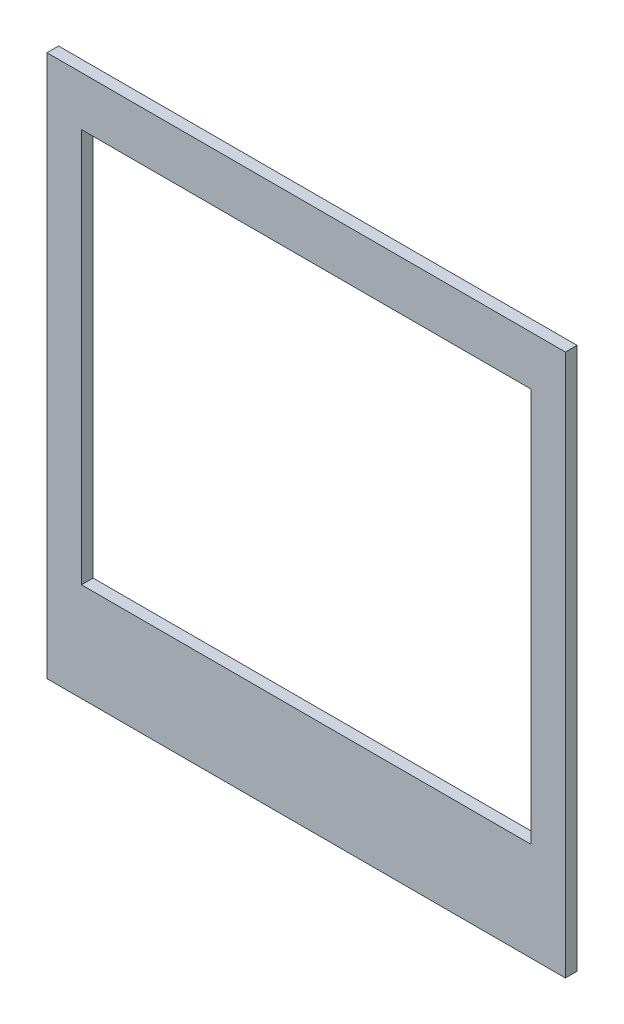
ISO-10303-21;
HEADER;
FILE_DESCRIPTION(('STEP AP214'),'2;1');
FILE_NAME('part.step','',(''),(''),'','','');
FILE_SCHEMA(('AUTOMOTIVE_DESIGN { 1 0 10303 214 1 1 1 1 }'));
ENDSEC;
DATA;
#1=APPLICATION_CONTEXT('core data for automotive mechanical design processes');
#2=APPLICATION_PROTOCOL_DEFINITION('international standard','automotive_design',2000,#1);
#3=PRODUCT_CONTEXT('',#1,'mechanical');
#4=PRODUCT('Part','Part','',(#3));
#5=PRODUCT_RELATED_PRODUCT_CATEGORY('part','',(#4));
#6=PRODUCT_DEFINITION_FORMATION('','',#4);
#7=PRODUCT_DEFINITION_CONTEXT('part definition',#1,'design');
#8=PRODUCT_DEFINITION('design','',#6,#7);
#9=PRODUCT_DEFINITION_SHAPE('','',#8);
#10=(LENGTH_UNIT() NAMED_UNIT(*) SI_UNIT(.MILLI.,.METRE.));
#11=(NAMED_UNIT(*) PLANE_ANGLE_UNIT() SI_UNIT($,.RADIAN.));
#12=(NAMED_UNIT(*) SI_UNIT($,.STERADIAN.) SOLID_ANGLE_UNIT());
#13=UNCERTAINTY_MEASURE_WITH_UNIT(LENGTH_MEASURE(1.E-05),#10,'distance_accuracy_value','');
#14=(GEOMETRIC_REPRESENTATION_CONTEXT(3) GLOBAL_UNCERTAINTY_ASSIGNED_CONTEXT((#13)) GLOBAL_UNIT_ASSIGNED_CONTEXT((#10,
#11,#12)) REPRESENTATION_CONTEXT('',''));
#15=CARTESIAN_POINT('',(0.,0.,0.));
#16=DIRECTION('',(0.,0.,1.));
#17=DIRECTION('',(1.,0.,0.));
#18=AXIS2_PLACEMENT_3D('',#15,#16,#17);
#19=CARTESIAN_POINT('',(0.,0.,3.));
#20=DIRECTION('',(0.,0.,-1.));
#21=DIRECTION('',(-1.,0.,0.));
#22=AXIS2_PLACEMENT_3D('',#19,#20,#21);
#23=PLANE('',#22);
#24=DIRECTION('',(0.,-1.,0.));
#25=VECTOR('',#24,1.);
#26=CARTESIAN_POINT('',(784.214713692254,851.828278213205,3.));
#27=LINE('',#26,#25);
#28=CARTESIAN_POINT('',(784.214713692254,991.528278213205,3.));
#29=VERTEX_POINT('',#28);
#30=CARTESIAN_POINT('',(784.214713692254,851.828278213205,3.));
#31=VERTEX_POINT('',#30);
#32=EDGE_CURVE('E142',#29,#31,#27,.T.);
#33=ORIENTED_EDGE('',*,*,#32,.T.);
#34=DIRECTION('',(1.,0.,0.));
#35=VECTOR('',#34,1.);
#36=CARTESIAN_POINT('',(917.818713692254,851.828278213205,3.));
#37=LINE('',#36,#35);
#38=CARTESIAN_POINT('',(917.818713692254,851.828278213205,3.));
#39=VERTEX_POINT('',#38);
#40=EDGE_CURVE('E145',#31,#39,#37,.T.);
#41=ORIENTED_EDGE('',*,*,#40,.T.);
#42=DIRECTION('',(0.,1.,0.));
#43=VECTOR('',#42,1.);
#44=CARTESIAN_POINT('',(917.818713692254,991.528278213205,3.));
#45=LINE('',#44,#43);
#46=CARTESIAN_POINT('',(917.818713692254,991.528278213205,3.));
#47=VERTEX_POINT('',#46);
#48=EDGE_CURVE('E148',#39,#47,#45,.T.);
#49=ORIENTED_EDGE('',*,*,#48,.T.);
#50=DIRECTION('',(-1.,0.,0.));
#51=VECTOR('',#50,1.);
#52=CARTESIAN_POINT('',(784.214713692254,991.528278213205,3.));
#53=LINE('',#52,#51);
#54=EDGE_CURVE('E150',#47,#29,#53,.T.);
#55=ORIENTED_EDGE('',*,*,#54,.T.);
#56=EDGE_LOOP('',(#33,#41,#49,#55));
#57=FACE_BOUND('',#56,.T.);
#58=DIRECTION('',(1.,0.,0.));
#59=VECTOR('',#58,1.);
#60=CARTESIAN_POINT('',(908.928713692255,877.228278213205,3.));
#61=LINE('',#60,#59);
#62=CARTESIAN_POINT('',(793.104713692254,877.228278213205,3.));
#63=VERTEX_POINT('',#62);
#64=CARTESIAN_POINT('',(908.928713692255,877.228278213205,3.));
#65=VERTEX_POINT('',#64);
#66=EDGE_CURVE('E106',#63,#65,#61,.T.);
#67=ORIENTED_EDGE('',*,*,#66,.F.);
#68=DIRECTION('',(0.,-1.,0.));
#69=VECTOR('',#68,1.);
#70=CARTESIAN_POINT('',(793.104713692254,877.228278213205,3.));
#71=LINE('',#70,#69);
#72=CARTESIAN_POINT('',(793.104713692254,978.828278213205,3.));
#73=VERTEX_POINT('',#72);
#74=EDGE_CURVE('E128',#73,#63,#71,.T.);
#75=ORIENTED_EDGE('',*,*,#74,.F.);
#76=DIRECTION('',(-1.,0.,0.));
#77=VECTOR('',#76,1.);
#78=CARTESIAN_POINT('',(793.104713692254,978.828278213205,3.));
#79=LINE('',#78,#77);
#80=CARTESIAN_POINT('',(908.928713692255,978.828278213205,3.));
#81=VERTEX_POINT('',#80);
#82=EDGE_CURVE('E126',#81,#73,#79,.T.);
#83=ORIENTED_EDGE('',*,*,#82,.F.);
#84=DIRECTION('',(0.,1.,0.));
#85=VECTOR('',#84,1.);
#86=CARTESIAN_POINT('',(908.928713692255,978.828278213205,3.));
#87=LINE('',#86,#85);
#88=EDGE_CURVE('E114',#65,#81,#87,.T.);
#89=ORIENTED_EDGE('',*,*,#88,.F.);
#90=EDGE_LOOP('',(#67,#75,#83,#89));
#91=FACE_BOUND('',#90,.T.);
#92=ADVANCED_FACE('F41',(#57,#91),#23,.F.);
#93=CARTESIAN_POINT('',(0.,0.,0.));
#94=DIRECTION('',(0.,0.,-1.));
#95=DIRECTION('',(-1.,0.,0.));
#96=AXIS2_PLACEMENT_3D('',#93,#94,#95);
#97=PLANE('',#96);
#98=DIRECTION('',(0.,-1.,0.));
#99=VECTOR('',#98,1.);
#100=CARTESIAN_POINT('',(784.214713692254,851.828278213205,0.));
#101=LINE('',#100,#99);
#102=CARTESIAN_POINT('',(784.214713692254,991.528278213205,0.));
#103=VERTEX_POINT('',#102);
#104=CARTESIAN_POINT('',(784.214713692254,851.828278213205,0.));
#105=VERTEX_POINT('',#104);
#106=EDGE_CURVE('E122',#103,#105,#101,.T.);
#107=ORIENTED_EDGE('',*,*,#106,.F.);
#108=DIRECTION('',(-1.,0.,0.));
#109=VECTOR('',#108,1.);
#110=CARTESIAN_POINT('',(784.214713692254,991.528278213205,0.));
#111=LINE('',#110,#109);
#112=CARTESIAN_POINT('',(917.818713692254,991.528278213205,0.));
#113=VERTEX_POINT('',#112);
#114=EDGE_CURVE('E146',#113,#103,#111,.T.);
#115=ORIENTED_EDGE('',*,*,#114,.F.);
#116=DIRECTION('',(0.,1.,0.));
#117=VECTOR('',#116,1.);
#118=CARTESIAN_POINT('',(917.818713692254,991.528278213205,0.));
#119=LINE('',#118,#117);
#120=CARTESIAN_POINT('',(917.818713692254,851.828278213205,0.));
#121=VERTEX_POINT('',#120);
#122=EDGE_CURVE('E157',#121,#113,#119,.T.);
#123=ORIENTED_EDGE('',*,*,#122,.F.);
#124=DIRECTION('',(1.,0.,0.));
#125=VECTOR('',#124,1.);
#126=CARTESIAN_POINT('',(917.818713692254,851.828278213205,0.));
#127=LINE('',#126,#125);
#128=EDGE_CURVE('E155',#105,#121,#127,.T.);
#129=ORIENTED_EDGE('',*,*,#128,.F.);
#130=EDGE_LOOP('',(#107,#115,#123,#129));
#131=FACE_BOUND('',#130,.T.);
#132=DIRECTION('',(0.,-1.,0.));
#133=VECTOR('',#132,1.);
#134=CARTESIAN_POINT('',(793.104713692254,877.228278213205,0.));
#135=LINE('',#134,#133);
#136=CARTESIAN_POINT('',(793.104713692254,978.828278213205,0.));
#137=VERTEX_POINT('',#136);
#138=CARTESIAN_POINT('',(793.104713692254,877.228278213205,0.));
#139=VERTEX_POINT('',#138);
#140=EDGE_CURVE('E115',#137,#139,#135,.T.);
#141=ORIENTED_EDGE('',*,*,#140,.T.);
#142=DIRECTION('',(1.,0.,0.));
#143=VECTOR('',#142,1.);
#144=CARTESIAN_POINT('',(908.928713692255,877.228278213205,0.));
#145=LINE('',#144,#143);
#146=CARTESIAN_POINT('',(908.928713692255,877.228278213205,0.));
#147=VERTEX_POINT('',#146);
#148=EDGE_CURVE('E64',#139,#147,#145,.T.);
#149=ORIENTED_EDGE('',*,*,#148,.T.);
#150=DIRECTION('',(0.,1.,0.));
#151=VECTOR('',#150,1.);
#152=CARTESIAN_POINT('',(908.928713692255,978.828278213205,0.));
#153=LINE('',#152,#151);
#154=CARTESIAN_POINT('',(908.928713692255,978.828278213205,0.));
#155=VERTEX_POINT('',#154);
#156=EDGE_CURVE('E121',#147,#155,#153,.T.);
#157=ORIENTED_EDGE('',*,*,#156,.T.);
#158=DIRECTION('',(-1.,0.,0.));
#159=VECTOR('',#158,1.);
#160=CARTESIAN_POINT('',(793.104713692254,978.828278213205,0.));
#161=LINE('',#160,#159);
#162=EDGE_CURVE('E134',#155,#137,#161,.T.);
#163=ORIENTED_EDGE('',*,*,#162,.T.);
#164=EDGE_LOOP('',(#141,#149,#157,#163));
#165=FACE_BOUND('',#164,.T.);
#166=ADVANCED_FACE('F175',(#131,#165),#97,.T.);
#167=CARTESIAN_POINT('',(784.214713692254,851.828278213205,3.));
#168=DIRECTION('',(1.,0.,0.));
#169=DIRECTION('',(0.,0.,-1.));
#170=AXIS2_PLACEMENT_3D('',#167,#168,#169);
#171=PLANE('',#170);
#172=ORIENTED_EDGE('',*,*,#106,.T.);
#173=DIRECTION('',(0.,0.,-1.));
#174=VECTOR('',#173,1.);
#175=CARTESIAN_POINT('',(784.214713692254,851.828278213205,3.));
#176=LINE('',#175,#174);
#177=EDGE_CURVE('E11',#31,#105,#176,.T.);
#178=ORIENTED_EDGE('',*,*,#177,.F.);
#179=ORIENTED_EDGE('',*,*,#32,.F.);
#180=DIRECTION('',(0.,0.,-1.));
#181=VECTOR('',#180,1.);
#182=CARTESIAN_POINT('',(784.214713692254,991.528278213205,3.));
#183=LINE('',#182,#181);
#184=EDGE_CURVE('E152',#29,#103,#183,.T.);
#185=ORIENTED_EDGE('',*,*,#184,.T.);
#186=EDGE_LOOP('',(#172,#178,#179,#185));
#187=FACE_BOUND('',#186,.T.);
#188=ADVANCED_FACE('F43',(#187),#171,.F.);
#189=CARTESIAN_POINT('',(917.818713692254,851.828278213205,3.));
#190=DIRECTION('',(0.,1.,0.));
#191=DIRECTION('',(0.,0.,1.));
#192=AXIS2_PLACEMENT_3D('',#189,#190,#191);
#193=PLANE('',#192);
#194=ORIENTED_EDGE('',*,*,#128,.T.);
#195=DIRECTION('',(0.,0.,-1.));
#196=VECTOR('',#195,1.);
#197=CARTESIAN_POINT('',(917.818713692254,851.828278213205,3.));
#198=LINE('',#197,#196);
#199=EDGE_CURVE('E49',#39,#121,#198,.T.);
#200=ORIENTED_EDGE('',*,*,#199,.F.);
#201=ORIENTED_EDGE('',*,*,#40,.F.);
#202=ORIENTED_EDGE('',*,*,#177,.T.);
#203=EDGE_LOOP('',(#194,#200,#201,#202));
#204=FACE_BOUND('',#203,.T.);
#205=ADVANCED_FACE('F185',(#204),#193,.F.);
#206=CARTESIAN_POINT('',(917.818713692254,991.528278213205,3.));
#207=DIRECTION('',(-1.,0.,0.));
#208=DIRECTION('',(0.,0.,1.));
#209=AXIS2_PLACEMENT_3D('',#206,#207,#208);
#210=PLANE('',#209);
#211=ORIENTED_EDGE('',*,*,#122,.T.);
#212=DIRECTION('',(0.,0.,-1.));
#213=VECTOR('',#212,1.);
#214=CARTESIAN_POINT('',(917.818713692254,991.528278213205,3.));
#215=LINE('',#214,#213);
#216=EDGE_CURVE('E162',#47,#113,#215,.T.);
#217=ORIENTED_EDGE('',*,*,#216,.F.);
#218=ORIENTED_EDGE('',*,*,#48,.F.);
#219=ORIENTED_EDGE('',*,*,#199,.T.);
#220=EDGE_LOOP('',(#211,#217,#218,#219));
#221=FACE_BOUND('',#220,.T.);
#222=ADVANCED_FACE('F169',(#221),#210,.F.);
#223=CARTESIAN_POINT('',(784.214713692254,991.528278213205,3.));
#224=DIRECTION('',(0.,-1.,0.));
#225=DIRECTION('',(0.,0.,-1.));
#226=AXIS2_PLACEMENT_3D('',#223,#224,#225);
#227=PLANE('',#226);
#228=ORIENTED_EDGE('',*,*,#114,.T.);
#229=ORIENTED_EDGE('',*,*,#184,.F.);
#230=ORIENTED_EDGE('',*,*,#54,.F.);
#231=ORIENTED_EDGE('',*,*,#216,.T.);
#232=EDGE_LOOP('',(#228,#229,#230,#231));
#233=FACE_BOUND('',#232,.T.);
#234=ADVANCED_FACE('F179',(#233),#227,.F.);
#235=CARTESIAN_POINT('',(908.928713692255,877.228278213205,3.));
#236=DIRECTION('',(0.,1.,0.));
#237=DIRECTION('',(0.,0.,1.));
#238=AXIS2_PLACEMENT_3D('',#235,#236,#237);
#239=PLANE('',#238);
#240=ORIENTED_EDGE('',*,*,#148,.F.);
#241=DIRECTION('',(0.,0.,-1.));
#242=VECTOR('',#241,1.);
#243=CARTESIAN_POINT('',(793.104713692254,877.228278213205,3.));
#244=LINE('',#243,#242);
#245=EDGE_CURVE('E110',#63,#139,#244,.T.);
#246=ORIENTED_EDGE('',*,*,#245,.F.);
#247=ORIENTED_EDGE('',*,*,#66,.T.);
#248=DIRECTION('',(0.,0.,-1.));
#249=VECTOR('',#248,1.);
#250=CARTESIAN_POINT('',(908.928713692255,877.228278213205,3.));
#251=LINE('',#250,#249);
#252=EDGE_CURVE('E109',#65,#147,#251,.T.);
#253=ORIENTED_EDGE('',*,*,#252,.T.);
#254=EDGE_LOOP('',(#240,#246,#247,#253));
#255=FACE_BOUND('',#254,.T.);
#256=ADVANCED_FACE('F108',(#255),#239,.T.);
#257=CARTESIAN_POINT('',(908.928713692255,978.828278213205,3.));
#258=DIRECTION('',(-1.,0.,0.));
#259=DIRECTION('',(0.,0.,1.));
#260=AXIS2_PLACEMENT_3D('',#257,#258,#259);
#261=PLANE('',#260);
#262=ORIENTED_EDGE('',*,*,#156,.F.);
#263=ORIENTED_EDGE('',*,*,#252,.F.);
#264=ORIENTED_EDGE('',*,*,#88,.T.);
#265=DIRECTION('',(0.,0.,-1.));
#266=VECTOR('',#265,1.);
#267=CARTESIAN_POINT('',(908.928713692255,978.828278213205,3.));
#268=LINE('',#267,#266);
#269=EDGE_CURVE('E123',#81,#155,#268,.T.);
#270=ORIENTED_EDGE('',*,*,#269,.T.);
#271=EDGE_LOOP('',(#262,#263,#264,#270));
#272=FACE_BOUND('',#271,.T.);
#273=ADVANCED_FACE('F118',(#272),#261,.T.);
#274=CARTESIAN_POINT('',(793.104713692254,978.828278213205,3.));
#275=DIRECTION('',(0.,-1.,0.));
#276=DIRECTION('',(0.,0.,-1.));
#277=AXIS2_PLACEMENT_3D('',#274,#275,#276);
#278=PLANE('',#277);
#279=ORIENTED_EDGE('',*,*,#162,.F.);
#280=ORIENTED_EDGE('',*,*,#269,.F.);
#281=ORIENTED_EDGE('',*,*,#82,.T.);
#282=DIRECTION('',(0.,0.,-1.));
#283=VECTOR('',#282,1.);
#284=CARTESIAN_POINT('',(793.104713692254,978.828278213205,3.));
#285=LINE('',#284,#283);
#286=EDGE_CURVE('E56',#73,#137,#285,.T.);
#287=ORIENTED_EDGE('',*,*,#286,.T.);
#288=EDGE_LOOP('',(#279,#280,#281,#287));
#289=FACE_BOUND('',#288,.T.);
#290=ADVANCED_FACE('F212',(#289),#278,.T.);
#291=CARTESIAN_POINT('',(793.104713692254,877.228278213205,3.));
#292=DIRECTION('',(1.,0.,0.));
#293=DIRECTION('',(0.,0.,-1.));
#294=AXIS2_PLACEMENT_3D('',#291,#292,#293);
#295=PLANE('',#294);
#296=ORIENTED_EDGE('',*,*,#140,.F.);
#297=ORIENTED_EDGE('',*,*,#286,.F.);
#298=ORIENTED_EDGE('',*,*,#74,.T.);
#299=ORIENTED_EDGE('',*,*,#245,.T.);
#300=EDGE_LOOP('',(#296,#297,#298,#299));
#301=FACE_BOUND('',#300,.T.);
#302=ADVANCED_FACE('F217',(#301),#295,.T.);
#303=CLOSED_SHELL('',(#92,#166,#188,#205,#222,#234,#256,#273,#290,#302));
#304=MANIFOLD_SOLID_BREP('B2',#303);
#305=ADVANCED_BREP_SHAPE_REPRESENTATION('',(#18,#304),#14);
#306=SHAPE_DEFINITION_REPRESENTATION(#9,#305);
ENDSEC;
END-ISO-10303-21;
